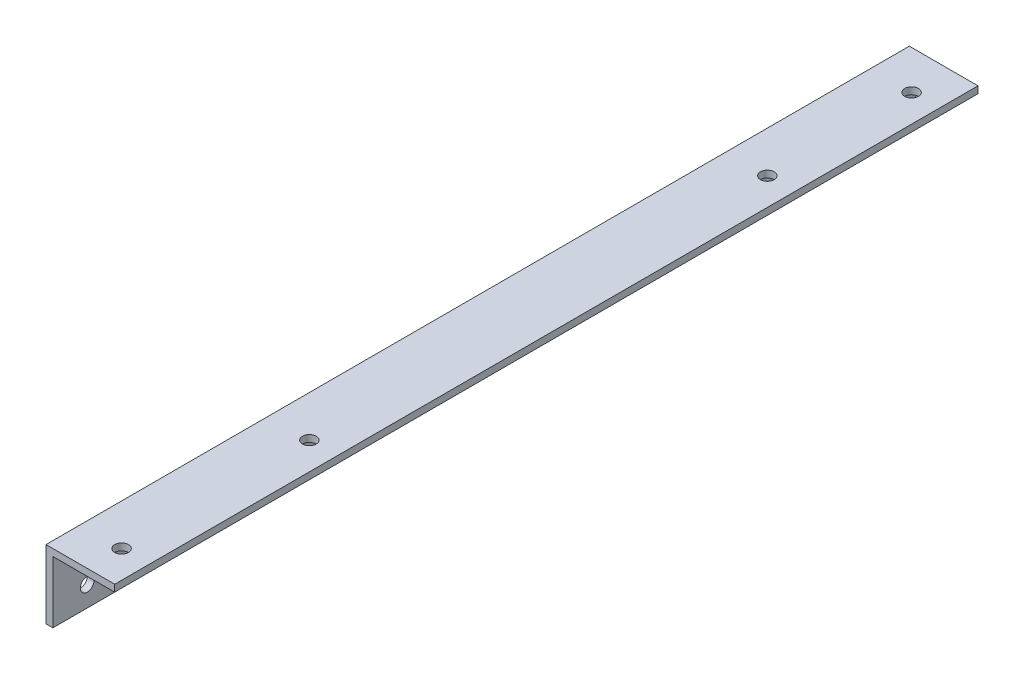
ISO-10303-21;
HEADER;
FILE_DESCRIPTION(('STEP AP214'),'2;1');
FILE_NAME('part.step','',(''),(''),'','','');
FILE_SCHEMA(('AUTOMOTIVE_DESIGN { 1 0 10303 214 1 1 1 1 }'));
ENDSEC;
DATA;
#1=APPLICATION_CONTEXT('core data for automotive mechanical design processes');
#2=APPLICATION_PROTOCOL_DEFINITION('international standard','automotive_design',2000,#1);
#3=PRODUCT_CONTEXT('',#1,'mechanical');
#4=PRODUCT('Part','Part','',(#3));
#5=PRODUCT_RELATED_PRODUCT_CATEGORY('part','',(#4));
#6=PRODUCT_DEFINITION_FORMATION('','',#4);
#7=PRODUCT_DEFINITION_CONTEXT('part definition',#1,'design');
#8=PRODUCT_DEFINITION('design','',#6,#7);
#9=PRODUCT_DEFINITION_SHAPE('','',#8);
#10=(LENGTH_UNIT() NAMED_UNIT(*) SI_UNIT(.MILLI.,.METRE.));
#11=(NAMED_UNIT(*) PLANE_ANGLE_UNIT() SI_UNIT($,.RADIAN.));
#12=(NAMED_UNIT(*) SI_UNIT($,.STERADIAN.) SOLID_ANGLE_UNIT());
#13=UNCERTAINTY_MEASURE_WITH_UNIT(LENGTH_MEASURE(1.E-05),#10,'distance_accuracy_value','');
#14=(GEOMETRIC_REPRESENTATION_CONTEXT(3) GLOBAL_UNCERTAINTY_ASSIGNED_CONTEXT((#13)) GLOBAL_UNIT_ASSIGNED_CONTEXT((#10,
#11,#12)) REPRESENTATION_CONTEXT('',''));
#15=CARTESIAN_POINT('',(0.,0.,0.));
#16=DIRECTION('',(0.,0.,1.));
#17=DIRECTION('',(1.,0.,0.));
#18=AXIS2_PLACEMENT_3D('',#15,#16,#17);
#19=CARTESIAN_POINT('',(-17.9770548008884,-24.6358947368421,188.5));
#20=DIRECTION('',(-1.,0.,0.));
#21=DIRECTION('',(0.,0.,1.));
#22=AXIS2_PLACEMENT_3D('',#19,#20,#21);
#23=PLANE('',#22);
#24=CARTESIAN_POINT('',(-17.9770548008884,-17.1358947368421,7.50000000000001));
#25=DIRECTION('',(1.,0.,0.));
#26=DIRECTION('',(0.,0.,-1.));
#27=AXIS2_PLACEMENT_3D('',#24,#25,#26);
#28=CIRCLE('',#27,1.72310260565882);
#29=CARTESIAN_POINT('',(-17.9770548008884,-17.1358947368421,5.77689739434119));
#30=VERTEX_POINT('',#29);
#31=EDGE_CURVE('E154',#30,#30,#28,.T.);
#32=ORIENTED_EDGE('',*,*,#31,.F.);
#33=EDGE_LOOP('',(#32));
#34=FACE_BOUND('',#33,.T.);
#35=CARTESIAN_POINT('',(-17.9770548008884,-20.1358947368421,181.));
#36=DIRECTION('',(1.,0.,0.));
#37=DIRECTION('',(0.,0.,-1.));
#38=AXIS2_PLACEMENT_3D('',#35,#36,#37);
#39=CIRCLE('',#38,1.5);
#40=CARTESIAN_POINT('',(-17.9770548008884,-20.1358947368421,179.5));
#41=VERTEX_POINT('',#40);
#42=EDGE_CURVE('E144',#41,#41,#39,.T.);
#43=ORIENTED_EDGE('',*,*,#42,.F.);
#44=EDGE_LOOP('',(#43));
#45=FACE_BOUND('',#44,.T.);
#46=CARTESIAN_POINT('',(-17.9770548008884,-20.1358947368421,140.));
#47=DIRECTION('',(1.,0.,0.));
#48=DIRECTION('',(0.,0.,-1.));
#49=AXIS2_PLACEMENT_3D('',#46,#47,#48);
#50=CIRCLE('',#49,1.5);
#51=CARTESIAN_POINT('',(-17.9770548008884,-20.1358947368421,138.5));
#52=VERTEX_POINT('',#51);
#53=EDGE_CURVE('E141',#52,#52,#50,.T.);
#54=ORIENTED_EDGE('',*,*,#53,.F.);
#55=EDGE_LOOP('',(#54));
#56=FACE_BOUND('',#55,.T.);
#57=CARTESIAN_POINT('',(-17.9770548008884,-20.1358947368421,40.));
#58=DIRECTION('',(1.,0.,0.));
#59=DIRECTION('',(0.,0.,-1.));
#60=AXIS2_PLACEMENT_3D('',#57,#58,#59);
#61=CIRCLE('',#60,1.5);
#62=CARTESIAN_POINT('',(-17.9770548008884,-20.1358947368421,38.5));
#63=VERTEX_POINT('',#62);
#64=EDGE_CURVE('E138',#63,#63,#61,.T.);
#65=ORIENTED_EDGE('',*,*,#64,.F.);
#66=EDGE_LOOP('',(#65));
#67=FACE_BOUND('',#66,.T.);
#68=DIRECTION('',(0.,1.,0.));
#69=VECTOR('',#68,1.);
#70=CARTESIAN_POINT('',(-17.9770548008884,-24.6358947368421,0.));
#71=LINE('',#70,#69);
#72=CARTESIAN_POINT('',(-17.9770548008884,-24.6358947368421,0.));
#73=VERTEX_POINT('',#72);
#74=CARTESIAN_POINT('',(-17.9770548008884,-11.1358947368421,0.));
#75=VERTEX_POINT('',#74);
#76=EDGE_CURVE('E117',#73,#75,#71,.T.);
#77=ORIENTED_EDGE('',*,*,#76,.T.);
#78=DIRECTION('',(0.,0.,-1.));
#79=VECTOR('',#78,1.);
#80=CARTESIAN_POINT('',(-17.9770548008884,-11.1358947368421,188.5));
#81=LINE('',#80,#79);
#82=CARTESIAN_POINT('',(-17.9770548008884,-11.1358947368421,188.5));
#83=VERTEX_POINT('',#82);
#84=EDGE_CURVE('E11',#83,#75,#81,.T.);
#85=ORIENTED_EDGE('',*,*,#84,.F.);
#86=DIRECTION('',(0.,1.,0.));
#87=VECTOR('',#86,1.);
#88=CARTESIAN_POINT('',(-17.9770548008884,-24.6358947368421,188.5));
#89=LINE('',#88,#87);
#90=CARTESIAN_POINT('',(-17.9770548008884,-24.6358947368421,188.5));
#91=VERTEX_POINT('',#90);
#92=EDGE_CURVE('E128',#91,#83,#89,.T.);
#93=ORIENTED_EDGE('',*,*,#92,.F.);
#94=DIRECTION('',(0.,0.,-1.));
#95=VECTOR('',#94,1.);
#96=CARTESIAN_POINT('',(-17.9770548008884,-24.6358947368421,188.5));
#97=LINE('',#96,#95);
#98=EDGE_CURVE('E113',#91,#73,#97,.T.);
#99=ORIENTED_EDGE('',*,*,#98,.T.);
#100=EDGE_LOOP('',(#77,#85,#93,#99));
#101=FACE_BOUND('',#100,.T.);
#102=ADVANCED_FACE('F31',(#34,#45,#56,#67,#101),#23,.F.);
#103=CARTESIAN_POINT('',(-17.9770548008884,-11.1358947368421,188.5));
#104=DIRECTION('',(0.,1.,0.));
#105=DIRECTION('',(0.,0.,1.));
#106=AXIS2_PLACEMENT_3D('',#103,#104,#105);
#107=PLANE('',#106);
#108=CARTESIAN_POINT('',(-10.4770548008884,-11.1358947368421,40.));
#109=DIRECTION('',(0.,1.,0.));
#110=DIRECTION('',(0.,0.,1.));
#111=AXIS2_PLACEMENT_3D('',#108,#109,#110);
#112=CIRCLE('',#111,1.5);
#113=CARTESIAN_POINT('',(-10.4770548008884,-11.1358947368421,41.5));
#114=VERTEX_POINT('',#113);
#115=EDGE_CURVE('E161',#114,#114,#112,.T.);
#116=ORIENTED_EDGE('',*,*,#115,.T.);
#117=EDGE_LOOP('',(#116));
#118=FACE_BOUND('',#117,.T.);
#119=CARTESIAN_POINT('',(-10.4770548008884,-11.1358947368421,140.));
#120=DIRECTION('',(0.,1.,0.));
#121=DIRECTION('',(0.,0.,1.));
#122=AXIS2_PLACEMENT_3D('',#119,#120,#121);
#123=CIRCLE('',#122,1.5);
#124=CARTESIAN_POINT('',(-10.4770548008884,-11.1358947368421,141.5));
#125=VERTEX_POINT('',#124);
#126=EDGE_CURVE('E167',#125,#125,#123,.T.);
#127=ORIENTED_EDGE('',*,*,#126,.T.);
#128=EDGE_LOOP('',(#127));
#129=FACE_BOUND('',#128,.T.);
#130=CARTESIAN_POINT('',(-10.4770548008884,-11.1358947368421,181.));
#131=DIRECTION('',(0.,1.,0.));
#132=DIRECTION('',(0.,0.,1.));
#133=AXIS2_PLACEMENT_3D('',#130,#131,#132);
#134=CIRCLE('',#133,1.5);
#135=CARTESIAN_POINT('',(-10.4770548008884,-11.1358947368421,182.5));
#136=VERTEX_POINT('',#135);
#137=EDGE_CURVE('E173',#136,#136,#134,.T.);
#138=ORIENTED_EDGE('',*,*,#137,.T.);
#139=EDGE_LOOP('',(#138));
#140=FACE_BOUND('',#139,.T.);
#141=CARTESIAN_POINT('',(-10.4770548008884,-11.1358947368421,8.50000000000001));
#142=DIRECTION('',(0.,1.,0.));
#143=DIRECTION('',(0.,0.,1.));
#144=AXIS2_PLACEMENT_3D('',#141,#142,#143);
#145=CIRCLE('',#144,1.5);
#146=CARTESIAN_POINT('',(-10.4770548008884,-11.1358947368421,10.));
#147=VERTEX_POINT('',#146);
#148=EDGE_CURVE('E121',#147,#147,#145,.T.);
#149=ORIENTED_EDGE('',*,*,#148,.T.);
#150=EDGE_LOOP('',(#149));
#151=FACE_BOUND('',#150,.T.);
#152=DIRECTION('',(1.,0.,0.));
#153=VECTOR('',#152,1.);
#154=CARTESIAN_POINT('',(-17.9770548008884,-11.1358947368421,0.));
#155=LINE('',#154,#153);
#156=CARTESIAN_POINT('',(-4.47705480088838,-11.1358947368421,0.));
#157=VERTEX_POINT('',#156);
#158=EDGE_CURVE('E120',#75,#157,#155,.T.);
#159=ORIENTED_EDGE('',*,*,#158,.T.);
#160=DIRECTION('',(0.,0.,-1.));
#161=VECTOR('',#160,1.);
#162=CARTESIAN_POINT('',(-4.47705480088838,-11.1358947368421,188.5));
#163=LINE('',#162,#161);
#164=CARTESIAN_POINT('',(-4.47705480088838,-11.1358947368421,188.5));
#165=VERTEX_POINT('',#164);
#166=EDGE_CURVE('E40',#165,#157,#163,.T.);
#167=ORIENTED_EDGE('',*,*,#166,.F.);
#168=DIRECTION('',(1.,0.,0.));
#169=VECTOR('',#168,1.);
#170=CARTESIAN_POINT('',(-17.9770548008884,-11.1358947368421,188.5));
#171=LINE('',#170,#169);
#172=EDGE_CURVE('E86',#83,#165,#171,.T.);
#173=ORIENTED_EDGE('',*,*,#172,.F.);
#174=ORIENTED_EDGE('',*,*,#84,.T.);
#175=EDGE_LOOP('',(#159,#167,#173,#174));
#176=FACE_BOUND('',#175,.T.);
#177=ADVANCED_FACE('F184',(#118,#129,#140,#151,#176),#107,.F.);
#178=CARTESIAN_POINT('',(-4.47705480088838,-11.1358947368421,188.5));
#179=DIRECTION('',(-1.,0.,0.));
#180=DIRECTION('',(0.,0.,1.));
#181=AXIS2_PLACEMENT_3D('',#178,#179,#180);
#182=PLANE('',#181);
#183=DIRECTION('',(0.,1.,0.));
#184=VECTOR('',#183,1.);
#185=CARTESIAN_POINT('',(-4.47705480088838,-11.1358947368421,0.));
#186=LINE('',#185,#184);
#187=CARTESIAN_POINT('',(-4.47705480088838,-9.63589473684211,0.));
#188=VERTEX_POINT('',#187);
#189=EDGE_CURVE('E123',#157,#188,#186,.T.);
#190=ORIENTED_EDGE('',*,*,#189,.T.);
#191=DIRECTION('',(0.,0.,-1.));
#192=VECTOR('',#191,1.);
#193=CARTESIAN_POINT('',(-4.47705480088838,-9.63589473684211,188.5));
#194=LINE('',#193,#192);
#195=CARTESIAN_POINT('',(-4.47705480088838,-9.63589473684211,188.5));
#196=VERTEX_POINT('',#195);
#197=EDGE_CURVE('E108',#196,#188,#194,.T.);
#198=ORIENTED_EDGE('',*,*,#197,.F.);
#199=DIRECTION('',(0.,1.,0.));
#200=VECTOR('',#199,1.);
#201=CARTESIAN_POINT('',(-4.47705480088838,-11.1358947368421,188.5));
#202=LINE('',#201,#200);
#203=EDGE_CURVE('E99',#165,#196,#202,.T.);
#204=ORIENTED_EDGE('',*,*,#203,.F.);
#205=ORIENTED_EDGE('',*,*,#166,.T.);
#206=EDGE_LOOP('',(#190,#198,#204,#205));
#207=FACE_BOUND('',#206,.T.);
#208=ADVANCED_FACE('F187',(#207),#182,.F.);
#209=CARTESIAN_POINT('',(-4.47705480088838,-9.63589473684211,188.5));
#210=DIRECTION('',(0.,-1.,0.));
#211=DIRECTION('',(1.,0.,0.));
#212=AXIS2_PLACEMENT_3D('',#209,#210,#211);
#213=PLANE('',#212);
#214=CARTESIAN_POINT('',(-10.4770548008884,-9.63589473684211,40.));
#215=DIRECTION('',(0.,1.,0.));
#216=DIRECTION('',(-1.,0.,0.));
#217=AXIS2_PLACEMENT_3D('',#214,#215,#216);
#218=CIRCLE('',#217,1.5);
#219=CARTESIAN_POINT('',(-11.9770548008884,-9.63589473684211,40.));
#220=VERTEX_POINT('',#219);
#221=EDGE_CURVE('E137',#220,#220,#218,.T.);
#222=ORIENTED_EDGE('',*,*,#221,.F.);
#223=EDGE_LOOP('',(#222));
#224=FACE_BOUND('',#223,.T.);
#225=CARTESIAN_POINT('',(-10.4770548008884,-9.63589473684211,140.));
#226=DIRECTION('',(0.,1.,0.));
#227=DIRECTION('',(-1.,0.,0.));
#228=AXIS2_PLACEMENT_3D('',#225,#226,#227);
#229=CIRCLE('',#228,1.5);
#230=CARTESIAN_POINT('',(-11.9770548008884,-9.63589473684211,140.));
#231=VERTEX_POINT('',#230);
#232=EDGE_CURVE('E164',#231,#231,#229,.T.);
#233=ORIENTED_EDGE('',*,*,#232,.F.);
#234=EDGE_LOOP('',(#233));
#235=FACE_BOUND('',#234,.T.);
#236=CARTESIAN_POINT('',(-10.4770548008884,-9.63589473684211,181.));
#237=DIRECTION('',(0.,1.,0.));
#238=DIRECTION('',(-1.,0.,0.));
#239=AXIS2_PLACEMENT_3D('',#236,#237,#238);
#240=CIRCLE('',#239,1.5);
#241=CARTESIAN_POINT('',(-11.9770548008884,-9.63589473684211,181.));
#242=VERTEX_POINT('',#241);
#243=EDGE_CURVE('E170',#242,#242,#240,.T.);
#244=ORIENTED_EDGE('',*,*,#243,.F.);
#245=EDGE_LOOP('',(#244));
#246=FACE_BOUND('',#245,.T.);
#247=CARTESIAN_POINT('',(-10.4770548008884,-9.63589473684211,8.50000000000001));
#248=DIRECTION('',(0.,1.,0.));
#249=DIRECTION('',(-1.,0.,0.));
#250=AXIS2_PLACEMENT_3D('',#247,#248,#249);
#251=CIRCLE('',#250,1.5);
#252=CARTESIAN_POINT('',(-11.9770548008884,-9.63589473684211,8.50000000000001));
#253=VERTEX_POINT('',#252);
#254=EDGE_CURVE('E176',#253,#253,#251,.T.);
#255=ORIENTED_EDGE('',*,*,#254,.F.);
#256=EDGE_LOOP('',(#255));
#257=FACE_BOUND('',#256,.T.);
#258=DIRECTION('',(-1.,0.,0.));
#259=VECTOR('',#258,1.);
#260=CARTESIAN_POINT('',(-4.47705480088838,-9.63589473684211,0.));
#261=LINE('',#260,#259);
#262=CARTESIAN_POINT('',(-19.4770548008884,-9.63589473684211,0.));
#263=VERTEX_POINT('',#262);
#264=EDGE_CURVE('E107',#188,#263,#261,.T.);
#265=ORIENTED_EDGE('',*,*,#264,.T.);
#266=DIRECTION('',(0.,0.,-1.));
#267=VECTOR('',#266,1.);
#268=CARTESIAN_POINT('',(-19.4770548008884,-9.63589473684211,188.5));
#269=LINE('',#268,#267);
#270=CARTESIAN_POINT('',(-19.4770548008884,-9.63589473684211,188.5));
#271=VERTEX_POINT('',#270);
#272=EDGE_CURVE('E104',#271,#263,#269,.T.);
#273=ORIENTED_EDGE('',*,*,#272,.F.);
#274=DIRECTION('',(-1.,0.,0.));
#275=VECTOR('',#274,1.);
#276=CARTESIAN_POINT('',(-4.47705480088838,-9.63589473684211,188.5));
#277=LINE('',#276,#275);
#278=EDGE_CURVE('E93',#196,#271,#277,.T.);
#279=ORIENTED_EDGE('',*,*,#278,.F.);
#280=ORIENTED_EDGE('',*,*,#197,.T.);
#281=EDGE_LOOP('',(#265,#273,#279,#280));
#282=FACE_BOUND('',#281,.T.);
#283=ADVANCED_FACE('F105',(#224,#235,#246,#257,#282),#213,.F.);
#284=CARTESIAN_POINT('',(-19.4770548008884,-9.63589473684211,188.5));
#285=DIRECTION('',(1.,0.,0.));
#286=DIRECTION('',(0.,1.,0.));
#287=AXIS2_PLACEMENT_3D('',#284,#285,#286);
#288=PLANE('',#287);
#289=CARTESIAN_POINT('',(-19.4770548008884,-17.1358947368421,7.50000000000001));
#290=DIRECTION('',(1.,0.,0.));
#291=DIRECTION('',(0.,1.,0.));
#292=AXIS2_PLACEMENT_3D('',#289,#290,#291);
#293=CIRCLE('',#292,1.72310260565882);
#294=CARTESIAN_POINT('',(-19.4770548008884,-15.4127921311833,7.50000000000001));
#295=VERTEX_POINT('',#294);
#296=EDGE_CURVE('E34',#295,#295,#293,.T.);
#297=ORIENTED_EDGE('',*,*,#296,.T.);
#298=EDGE_LOOP('',(#297));
#299=FACE_BOUND('',#298,.T.);
#300=CARTESIAN_POINT('',(-19.4770548008884,-20.1358947368421,181.));
#301=DIRECTION('',(1.,0.,0.));
#302=DIRECTION('',(0.,1.,0.));
#303=AXIS2_PLACEMENT_3D('',#300,#301,#302);
#304=CIRCLE('',#303,1.5);
#305=CARTESIAN_POINT('',(-19.4770548008884,-18.6358947368421,181.));
#306=VERTEX_POINT('',#305);
#307=EDGE_CURVE('E142',#306,#306,#304,.T.);
#308=ORIENTED_EDGE('',*,*,#307,.T.);
#309=EDGE_LOOP('',(#308));
#310=FACE_BOUND('',#309,.T.);
#311=CARTESIAN_POINT('',(-19.4770548008884,-20.1358947368421,140.));
#312=DIRECTION('',(1.,0.,0.));
#313=DIRECTION('',(0.,1.,0.));
#314=AXIS2_PLACEMENT_3D('',#311,#312,#313);
#315=CIRCLE('',#314,1.5);
#316=CARTESIAN_POINT('',(-19.4770548008884,-18.6358947368421,140.));
#317=VERTEX_POINT('',#316);
#318=EDGE_CURVE('E139',#317,#317,#315,.T.);
#319=ORIENTED_EDGE('',*,*,#318,.T.);
#320=EDGE_LOOP('',(#319));
#321=FACE_BOUND('',#320,.T.);
#322=CARTESIAN_POINT('',(-19.4770548008884,-20.1358947368421,40.));
#323=DIRECTION('',(1.,0.,0.));
#324=DIRECTION('',(0.,1.,0.));
#325=AXIS2_PLACEMENT_3D('',#322,#323,#324);
#326=CIRCLE('',#325,1.5);
#327=CARTESIAN_POINT('',(-19.4770548008884,-18.6358947368421,40.));
#328=VERTEX_POINT('',#327);
#329=EDGE_CURVE('E134',#328,#328,#326,.T.);
#330=ORIENTED_EDGE('',*,*,#329,.T.);
#331=EDGE_LOOP('',(#330));
#332=FACE_BOUND('',#331,.T.);
#333=DIRECTION('',(0.,-1.,0.));
#334=VECTOR('',#333,1.);
#335=CARTESIAN_POINT('',(-19.4770548008884,-9.63589473684211,0.));
#336=LINE('',#335,#334);
#337=CARTESIAN_POINT('',(-19.4770548008884,-24.6358947368421,0.));
#338=VERTEX_POINT('',#337);
#339=EDGE_CURVE('E72',#263,#338,#336,.T.);
#340=ORIENTED_EDGE('',*,*,#339,.T.);
#341=DIRECTION('',(0.,0.,-1.));
#342=VECTOR('',#341,1.);
#343=CARTESIAN_POINT('',(-19.4770548008884,-24.6358947368421,188.5));
#344=LINE('',#343,#342);
#345=CARTESIAN_POINT('',(-19.4770548008884,-24.6358947368421,188.5));
#346=VERTEX_POINT('',#345);
#347=EDGE_CURVE('E109',#346,#338,#344,.T.);
#348=ORIENTED_EDGE('',*,*,#347,.F.);
#349=DIRECTION('',(0.,-1.,0.));
#350=VECTOR('',#349,1.);
#351=CARTESIAN_POINT('',(-19.4770548008884,-9.63589473684211,188.5));
#352=LINE('',#351,#350);
#353=EDGE_CURVE('E97',#271,#346,#352,.T.);
#354=ORIENTED_EDGE('',*,*,#353,.F.);
#355=ORIENTED_EDGE('',*,*,#272,.T.);
#356=EDGE_LOOP('',(#340,#348,#354,#355));
#357=FACE_BOUND('',#356,.T.);
#358=ADVANCED_FACE('F111',(#299,#310,#321,#332,#357),#288,.F.);
#359=CARTESIAN_POINT('',(-19.4770548008884,-24.6358947368421,188.5));
#360=DIRECTION('',(0.,1.,0.));
#361=DIRECTION('',(0.,0.,1.));
#362=AXIS2_PLACEMENT_3D('',#359,#360,#361);
#363=PLANE('',#362);
#364=DIRECTION('',(1.,0.,0.));
#365=VECTOR('',#364,1.);
#366=CARTESIAN_POINT('',(-19.4770548008884,-24.6358947368421,0.));
#367=LINE('',#366,#365);
#368=EDGE_CURVE('E78',#338,#73,#367,.T.);
#369=ORIENTED_EDGE('',*,*,#368,.T.);
#370=ORIENTED_EDGE('',*,*,#98,.F.);
#371=DIRECTION('',(1.,0.,0.));
#372=VECTOR('',#371,1.);
#373=CARTESIAN_POINT('',(-19.4770548008884,-24.6358947368421,188.5));
#374=LINE('',#373,#372);
#375=EDGE_CURVE('E49',#346,#91,#374,.T.);
#376=ORIENTED_EDGE('',*,*,#375,.F.);
#377=ORIENTED_EDGE('',*,*,#347,.T.);
#378=EDGE_LOOP('',(#369,#370,#376,#377));
#379=FACE_BOUND('',#378,.T.);
#380=ADVANCED_FACE('F192',(#379),#363,.F.);
#381=CARTESIAN_POINT('',(-17.9770548008884,-11.1358947368421,188.5));
#382=DIRECTION('',(0.,0.,-1.));
#383=DIRECTION('',(-1.,0.,0.));
#384=AXIS2_PLACEMENT_3D('',#381,#382,#383);
#385=PLANE('',#384);
#386=ORIENTED_EDGE('',*,*,#92,.T.);
#387=ORIENTED_EDGE('',*,*,#172,.T.);
#388=ORIENTED_EDGE('',*,*,#203,.T.);
#389=ORIENTED_EDGE('',*,*,#278,.T.);
#390=ORIENTED_EDGE('',*,*,#353,.T.);
#391=ORIENTED_EDGE('',*,*,#375,.T.);
#392=EDGE_LOOP('',(#386,#387,#388,#389,#390,#391));
#393=FACE_BOUND('',#392,.T.);
#394=ADVANCED_FACE('F95',(#393),#385,.F.);
#395=CARTESIAN_POINT('',(-17.9770548008884,-11.1358947368421,0.));
#396=DIRECTION('',(0.,0.,-1.));
#397=DIRECTION('',(-1.,0.,0.));
#398=AXIS2_PLACEMENT_3D('',#395,#396,#397);
#399=PLANE('',#398);
#400=ORIENTED_EDGE('',*,*,#76,.F.);
#401=ORIENTED_EDGE('',*,*,#368,.F.);
#402=ORIENTED_EDGE('',*,*,#339,.F.);
#403=ORIENTED_EDGE('',*,*,#264,.F.);
#404=ORIENTED_EDGE('',*,*,#189,.F.);
#405=ORIENTED_EDGE('',*,*,#158,.F.);
#406=EDGE_LOOP('',(#400,#401,#402,#403,#404,#405));
#407=FACE_BOUND('',#406,.T.);
#408=ADVANCED_FACE('F190',(#407),#399,.T.);
#409=CARTESIAN_POINT('',(-10.4770548008883,-276.635894736842,8.50000000000001));
#410=DIRECTION('',(0.,1.,0.));
#411=DIRECTION('',(-1.,0.,0.));
#412=AXIS2_PLACEMENT_3D('',#409,#410,#411);
#413=CYLINDRICAL_SURFACE('',#412,1.5);
#414=ORIENTED_EDGE('',*,*,#254,.T.);
#415=EDGE_LOOP('',(#414));
#416=FACE_BOUND('',#415,.T.);
#417=ORIENTED_EDGE('',*,*,#148,.F.);
#418=EDGE_LOOP('',(#417));
#419=FACE_BOUND('',#418,.T.);
#420=ADVANCED_FACE('F243',(#416,#419),#413,.F.);
#421=CARTESIAN_POINT('',(-10.4770548008883,-276.635894736842,181.));
#422=DIRECTION('',(0.,1.,0.));
#423=DIRECTION('',(-1.,0.,0.));
#424=AXIS2_PLACEMENT_3D('',#421,#422,#423);
#425=CYLINDRICAL_SURFACE('',#424,1.5);
#426=ORIENTED_EDGE('',*,*,#243,.T.);
#427=EDGE_LOOP('',(#426));
#428=FACE_BOUND('',#427,.T.);
#429=ORIENTED_EDGE('',*,*,#137,.F.);
#430=EDGE_LOOP('',(#429));
#431=FACE_BOUND('',#430,.T.);
#432=ADVANCED_FACE('F239',(#428,#431),#425,.F.);
#433=CARTESIAN_POINT('',(-10.4770548008883,-276.635894736842,140.));
#434=DIRECTION('',(0.,1.,0.));
#435=DIRECTION('',(-1.,0.,0.));
#436=AXIS2_PLACEMENT_3D('',#433,#434,#435);
#437=CYLINDRICAL_SURFACE('',#436,1.5);
#438=ORIENTED_EDGE('',*,*,#232,.T.);
#439=EDGE_LOOP('',(#438));
#440=FACE_BOUND('',#439,.T.);
#441=ORIENTED_EDGE('',*,*,#126,.F.);
#442=EDGE_LOOP('',(#441));
#443=FACE_BOUND('',#442,.T.);
#444=ADVANCED_FACE('F232',(#440,#443),#437,.F.);
#445=CARTESIAN_POINT('',(-10.4770548008883,-276.635894736842,40.));
#446=DIRECTION('',(0.,1.,0.));
#447=DIRECTION('',(-1.,0.,0.));
#448=AXIS2_PLACEMENT_3D('',#445,#446,#447);
#449=CYLINDRICAL_SURFACE('',#448,1.5);
#450=ORIENTED_EDGE('',*,*,#221,.T.);
#451=EDGE_LOOP('',(#450));
#452=FACE_BOUND('',#451,.T.);
#453=ORIENTED_EDGE('',*,*,#115,.F.);
#454=EDGE_LOOP('',(#453));
#455=FACE_BOUND('',#454,.T.);
#456=ADVANCED_FACE('F221',(#452,#455),#449,.F.);
#457=CARTESIAN_POINT('',(-27.9770548008884,-20.1358947368421,40.));
#458=DIRECTION('',(1.,0.,0.));
#459=DIRECTION('',(0.,0.,-1.));
#460=AXIS2_PLACEMENT_3D('',#457,#458,#459);
#461=CYLINDRICAL_SURFACE('',#460,1.5);
#462=ORIENTED_EDGE('',*,*,#64,.T.);
#463=EDGE_LOOP('',(#462));
#464=FACE_BOUND('',#463,.T.);
#465=ORIENTED_EDGE('',*,*,#329,.F.);
#466=EDGE_LOOP('',(#465));
#467=FACE_BOUND('',#466,.T.);
#468=ADVANCED_FACE('F217',(#464,#467),#461,.F.);
#469=CARTESIAN_POINT('',(-27.9770548008884,-20.1358947368421,140.));
#470=DIRECTION('',(1.,0.,0.));
#471=DIRECTION('',(0.,0.,-1.));
#472=AXIS2_PLACEMENT_3D('',#469,#470,#471);
#473=CYLINDRICAL_SURFACE('',#472,1.5);
#474=ORIENTED_EDGE('',*,*,#53,.T.);
#475=EDGE_LOOP('',(#474));
#476=FACE_BOUND('',#475,.T.);
#477=ORIENTED_EDGE('',*,*,#318,.F.);
#478=EDGE_LOOP('',(#477));
#479=FACE_BOUND('',#478,.T.);
#480=ADVANCED_FACE('F220',(#476,#479),#473,.F.);
#481=CARTESIAN_POINT('',(-27.9770548008884,-20.1358947368421,181.));
#482=DIRECTION('',(1.,0.,0.));
#483=DIRECTION('',(0.,0.,-1.));
#484=AXIS2_PLACEMENT_3D('',#481,#482,#483);
#485=CYLINDRICAL_SURFACE('',#484,1.5);
#486=ORIENTED_EDGE('',*,*,#42,.T.);
#487=EDGE_LOOP('',(#486));
#488=FACE_BOUND('',#487,.T.);
#489=ORIENTED_EDGE('',*,*,#307,.F.);
#490=EDGE_LOOP('',(#489));
#491=FACE_BOUND('',#490,.T.);
#492=ADVANCED_FACE('F229',(#488,#491),#485,.F.);
#493=CARTESIAN_POINT('',(-27.9770548008884,-17.1358947368421,7.50000000000001));
#494=DIRECTION('',(1.,0.,0.));
#495=DIRECTION('',(0.,0.,-1.));
#496=AXIS2_PLACEMENT_3D('',#493,#494,#495);
#497=CYLINDRICAL_SURFACE('',#496,1.72310260565882);
#498=ORIENTED_EDGE('',*,*,#31,.T.);
#499=EDGE_LOOP('',(#498));
#500=FACE_BOUND('',#499,.T.);
#501=ORIENTED_EDGE('',*,*,#296,.F.);
#502=EDGE_LOOP('',(#501));
#503=FACE_BOUND('',#502,.T.);
#504=ADVANCED_FACE('F303',(#500,#503),#497,.F.);
#505=CLOSED_SHELL('',(#102,#177,#208,#283,#358,#380,#394,#408,#420,#432,#444,#456,#468,#480,
#492,#504));
#506=MANIFOLD_SOLID_BREP('B2',#505);
#507=ADVANCED_BREP_SHAPE_REPRESENTATION('',(#18,#506),#14);
#508=SHAPE_DEFINITION_REPRESENTATION(#9,#507);
ENDSEC;
END-ISO-10303-21;
